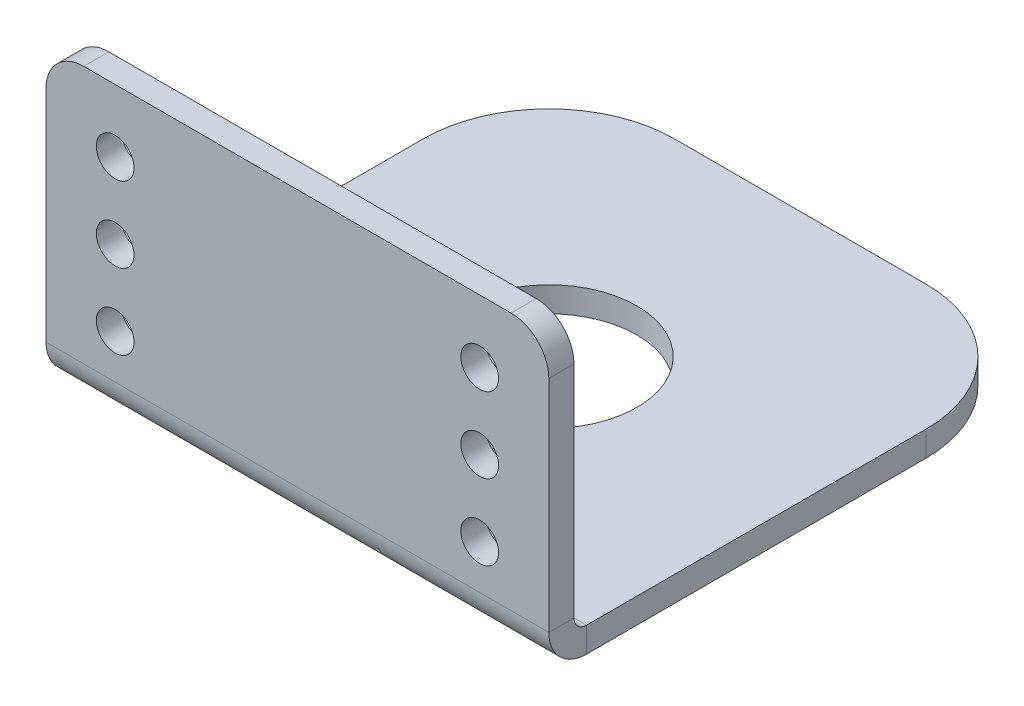
ISO-10303-21;
HEADER;
FILE_DESCRIPTION(('STEP AP214'),'2;1');
FILE_NAME('part.step','',(''),(''),'','','');
FILE_SCHEMA(('AUTOMOTIVE_DESIGN { 1 0 10303 214 1 1 1 1 }'));
ENDSEC;
DATA;
#1=APPLICATION_CONTEXT('core data for automotive mechanical design processes');
#2=APPLICATION_PROTOCOL_DEFINITION('international standard','automotive_design',2000,#1);
#3=PRODUCT_CONTEXT('',#1,'mechanical');
#4=PRODUCT('Part','Part','',(#3));
#5=PRODUCT_RELATED_PRODUCT_CATEGORY('part','',(#4));
#6=PRODUCT_DEFINITION_FORMATION('','',#4);
#7=PRODUCT_DEFINITION_CONTEXT('part definition',#1,'design');
#8=PRODUCT_DEFINITION('design','',#6,#7);
#9=PRODUCT_DEFINITION_SHAPE('','',#8);
#10=(LENGTH_UNIT() NAMED_UNIT(*) SI_UNIT(.MILLI.,.METRE.));
#11=(NAMED_UNIT(*) PLANE_ANGLE_UNIT() SI_UNIT($,.RADIAN.));
#12=(NAMED_UNIT(*) SI_UNIT($,.STERADIAN.) SOLID_ANGLE_UNIT());
#13=UNCERTAINTY_MEASURE_WITH_UNIT(LENGTH_MEASURE(1.E-05),#10,'distance_accuracy_value','');
#14=(GEOMETRIC_REPRESENTATION_CONTEXT(3) GLOBAL_UNCERTAINTY_ASSIGNED_CONTEXT((#13)) GLOBAL_UNIT_ASSIGNED_CONTEXT((#10,
#11,#12)) REPRESENTATION_CONTEXT('',''));
#15=CARTESIAN_POINT('',(0.,0.,0.));
#16=DIRECTION('',(0.,0.,1.));
#17=DIRECTION('',(1.,0.,0.));
#18=AXIS2_PLACEMENT_3D('',#15,#16,#17);
#19=CARTESIAN_POINT('',(20.,-2.,19.));
#20=DIRECTION('',(1.,0.,0.));
#21=DIRECTION('',(0.,0.,-1.));
#22=AXIS2_PLACEMENT_3D('',#19,#20,#21);
#23=PLANE('',#22);
#24=DIRECTION('',(0.,0.,-1.));
#25=VECTOR('',#24,1.);
#26=CARTESIAN_POINT('',(20.,-2.,19.));
#27=LINE('',#26,#25);
#28=CARTESIAN_POINT('',(20.,-2.,18.));
#29=VERTEX_POINT('',#28);
#30=CARTESIAN_POINT('',(20.,-2.,-9.));
#31=VERTEX_POINT('',#30);
#32=EDGE_CURVE('E204',#29,#31,#27,.T.);
#33=ORIENTED_EDGE('',*,*,#32,.T.);
#34=DIRECTION('',(0.,1.,0.));
#35=VECTOR('',#34,1.);
#36=CARTESIAN_POINT('',(20.,-2.,-9.));
#37=LINE('',#36,#35);
#38=CARTESIAN_POINT('',(20.,0.,-9.));
#39=VERTEX_POINT('',#38);
#40=EDGE_CURVE('E211',#31,#39,#37,.T.);
#41=ORIENTED_EDGE('',*,*,#40,.T.);
#42=DIRECTION('',(0.,0.,-1.));
#43=VECTOR('',#42,1.);
#44=CARTESIAN_POINT('',(20.,0.,19.));
#45=LINE('',#44,#43);
#46=CARTESIAN_POINT('',(20.,0.,18.));
#47=VERTEX_POINT('',#46);
#48=EDGE_CURVE('E213',#47,#39,#45,.T.);
#49=ORIENTED_EDGE('',*,*,#48,.F.);
#50=DIRECTION('',(0.,-1.,0.));
#51=VECTOR('',#50,1.);
#52=CARTESIAN_POINT('',(20.,0.,18.));
#53=LINE('',#52,#51);
#54=EDGE_CURVE('E178',#47,#29,#53,.T.);
#55=ORIENTED_EDGE('',*,*,#54,.T.);
#56=EDGE_LOOP('',(#33,#41,#49,#55));
#57=FACE_BOUND('',#56,.T.);
#58=ADVANCED_FACE('F41',(#57),#23,.T.);
#59=CARTESIAN_POINT('',(0.,-2.,0.));
#60=DIRECTION('',(0.,1.,0.));
#61=DIRECTION('',(0.,0.,1.));
#62=AXIS2_PLACEMENT_3D('',#59,#60,#61);
#63=PLANE('',#62);
#64=CARTESIAN_POINT('',(0.,-2.,1.));
#65=DIRECTION('',(0.,1.,0.));
#66=DIRECTION('',(0.,0.,1.));
#67=AXIS2_PLACEMENT_3D('',#64,#65,#66);
#68=CIRCLE('',#67,7.);
#69=CARTESIAN_POINT('',(0.,-2.,8.));
#70=VERTEX_POINT('',#69);
#71=EDGE_CURVE('E198',#70,#70,#68,.T.);
#72=ORIENTED_EDGE('',*,*,#71,.T.);
#73=EDGE_LOOP('',(#72));
#74=FACE_BOUND('',#73,.T.);
#75=CARTESIAN_POINT('',(0.,-2.,10.5));
#76=DIRECTION('',(0.,1.,0.));
#77=DIRECTION('',(0.,0.,1.));
#78=AXIS2_PLACEMENT_3D('',#75,#76,#77);
#79=CIRCLE('',#78,1.5);
#80=CARTESIAN_POINT('',(0.,-2.,12.));
#81=VERTEX_POINT('',#80);
#82=EDGE_CURVE('E190',#81,#81,#79,.T.);
#83=ORIENTED_EDGE('',*,*,#82,.T.);
#84=EDGE_LOOP('',(#83));
#85=FACE_BOUND('',#84,.T.);
#86=DIRECTION('',(-1.,0.,0.));
#87=VECTOR('',#86,1.);
#88=CARTESIAN_POINT('',(20.,-2.,-19.));
#89=LINE('',#88,#87);
#90=CARTESIAN_POINT('',(10.,-2.,-19.));
#91=VERTEX_POINT('',#90);
#92=CARTESIAN_POINT('',(-10.,-2.,-19.));
#93=VERTEX_POINT('',#92);
#94=EDGE_CURVE('E208',#91,#93,#89,.T.);
#95=ORIENTED_EDGE('',*,*,#94,.F.);
#96=CARTESIAN_POINT('',(10.,-2.,-9.));
#97=DIRECTION('',(0.,1.,0.));
#98=DIRECTION('',(0.,0.,1.));
#99=AXIS2_PLACEMENT_3D('',#96,#97,#98);
#100=CIRCLE('',#99,10.);
#101=EDGE_CURVE('E233',#91,#31,#100,.F.);
#102=ORIENTED_EDGE('',*,*,#101,.T.);
#103=ORIENTED_EDGE('',*,*,#32,.F.);
#104=DIRECTION('',(1.,0.,0.));
#105=VECTOR('',#104,1.);
#106=CARTESIAN_POINT('',(20.,-2.,18.));
#107=LINE('',#106,#105);
#108=CARTESIAN_POINT('',(-20.,-2.,18.));
#109=VERTEX_POINT('',#108);
#110=EDGE_CURVE('E142',#29,#109,#107,.F.);
#111=ORIENTED_EDGE('',*,*,#110,.T.);
#112=DIRECTION('',(0.,0.,1.));
#113=VECTOR('',#112,1.);
#114=CARTESIAN_POINT('',(-20.,-2.,19.));
#115=LINE('',#114,#113);
#116=CARTESIAN_POINT('',(-20.,-2.,-9.));
#117=VERTEX_POINT('',#116);
#118=EDGE_CURVE('E205',#117,#109,#115,.T.);
#119=ORIENTED_EDGE('',*,*,#118,.F.);
#120=CARTESIAN_POINT('',(-10.,-2.,-9.));
#121=DIRECTION('',(0.,1.,0.));
#122=DIRECTION('',(0.,0.,1.));
#123=AXIS2_PLACEMENT_3D('',#120,#121,#122);
#124=CIRCLE('',#123,10.);
#125=EDGE_CURVE('E229',#117,#93,#124,.F.);
#126=ORIENTED_EDGE('',*,*,#125,.T.);
#127=EDGE_LOOP('',(#95,#102,#103,#111,#119,#126));
#128=FACE_BOUND('',#127,.T.);
#129=ADVANCED_FACE('F345',(#74,#85,#128),#63,.F.);
#130=CARTESIAN_POINT('',(0.,0.,0.));
#131=DIRECTION('',(0.,1.,0.));
#132=DIRECTION('',(0.,0.,1.));
#133=AXIS2_PLACEMENT_3D('',#130,#131,#132);
#134=PLANE('',#133);
#135=CARTESIAN_POINT('',(0.,0.,1.));
#136=DIRECTION('',(0.,1.,0.));
#137=DIRECTION('',(0.,0.,1.));
#138=AXIS2_PLACEMENT_3D('',#135,#136,#137);
#139=CIRCLE('',#138,7.);
#140=CARTESIAN_POINT('',(0.,0.,8.));
#141=VERTEX_POINT('',#140);
#142=EDGE_CURVE('E194',#141,#141,#139,.T.);
#143=ORIENTED_EDGE('',*,*,#142,.F.);
#144=EDGE_LOOP('',(#143));
#145=FACE_BOUND('',#144,.T.);
#146=CARTESIAN_POINT('',(0.,0.,10.5));
#147=DIRECTION('',(0.,1.,0.));
#148=DIRECTION('',(0.,0.,1.));
#149=AXIS2_PLACEMENT_3D('',#146,#147,#148);
#150=CIRCLE('',#149,1.5);
#151=CARTESIAN_POINT('',(0.,0.,12.));
#152=VERTEX_POINT('',#151);
#153=EDGE_CURVE('E187',#152,#152,#150,.T.);
#154=ORIENTED_EDGE('',*,*,#153,.F.);
#155=EDGE_LOOP('',(#154));
#156=FACE_BOUND('',#155,.T.);
#157=ORIENTED_EDGE('',*,*,#48,.T.);
#158=CARTESIAN_POINT('',(10.,0.,-9.));
#159=DIRECTION('',(0.,1.,0.));
#160=DIRECTION('',(0.,0.,1.));
#161=AXIS2_PLACEMENT_3D('',#158,#159,#160);
#162=CIRCLE('',#161,10.);
#163=CARTESIAN_POINT('',(10.,0.,-19.));
#164=VERTEX_POINT('',#163);
#165=EDGE_CURVE('E225',#39,#164,#162,.T.);
#166=ORIENTED_EDGE('',*,*,#165,.T.);
#167=DIRECTION('',(-1.,0.,0.));
#168=VECTOR('',#167,1.);
#169=CARTESIAN_POINT('',(20.,0.,-19.));
#170=LINE('',#169,#168);
#171=CARTESIAN_POINT('',(-10.,0.,-19.));
#172=VERTEX_POINT('',#171);
#173=EDGE_CURVE('E202',#164,#172,#170,.T.);
#174=ORIENTED_EDGE('',*,*,#173,.T.);
#175=CARTESIAN_POINT('',(-10.,0.,-9.));
#176=DIRECTION('',(0.,1.,0.));
#177=DIRECTION('',(0.,0.,1.));
#178=AXIS2_PLACEMENT_3D('',#175,#176,#177);
#179=CIRCLE('',#178,10.);
#180=CARTESIAN_POINT('',(-20.,0.,-9.));
#181=VERTEX_POINT('',#180);
#182=EDGE_CURVE('E219',#172,#181,#179,.T.);
#183=ORIENTED_EDGE('',*,*,#182,.T.);
#184=DIRECTION('',(0.,0.,1.));
#185=VECTOR('',#184,1.);
#186=CARTESIAN_POINT('',(-20.,0.,19.));
#187=LINE('',#186,#185);
#188=CARTESIAN_POINT('',(-20.,0.,18.));
#189=VERTEX_POINT('',#188);
#190=EDGE_CURVE('E200',#181,#189,#187,.T.);
#191=ORIENTED_EDGE('',*,*,#190,.T.);
#192=DIRECTION('',(1.,0.,0.));
#193=VECTOR('',#192,1.);
#194=CARTESIAN_POINT('',(20.,0.,18.));
#195=LINE('',#194,#193);
#196=EDGE_CURVE('E177',#47,#189,#195,.F.);
#197=ORIENTED_EDGE('',*,*,#196,.F.);
#198=EDGE_LOOP('',(#157,#166,#174,#183,#191,#197));
#199=FACE_BOUND('',#198,.T.);
#200=ADVANCED_FACE('F349',(#145,#156,#199),#134,.T.);
#201=CARTESIAN_POINT('',(-20.,-2.,19.));
#202=DIRECTION('',(-1.,0.,0.));
#203=DIRECTION('',(0.,0.,1.));
#204=AXIS2_PLACEMENT_3D('',#201,#202,#203);
#205=PLANE('',#204);
#206=ORIENTED_EDGE('',*,*,#190,.F.);
#207=DIRECTION('',(0.,1.,0.));
#208=VECTOR('',#207,1.);
#209=CARTESIAN_POINT('',(-20.,-2.,-9.));
#210=LINE('',#209,#208);
#211=EDGE_CURVE('E231',#181,#117,#210,.F.);
#212=ORIENTED_EDGE('',*,*,#211,.T.);
#213=ORIENTED_EDGE('',*,*,#118,.T.);
#214=DIRECTION('',(0.,-1.,0.));
#215=VECTOR('',#214,1.);
#216=CARTESIAN_POINT('',(-20.,0.,18.));
#217=LINE('',#216,#215);
#218=EDGE_CURVE('E184',#189,#109,#217,.T.);
#219=ORIENTED_EDGE('',*,*,#218,.F.);
#220=EDGE_LOOP('',(#206,#212,#213,#219));
#221=FACE_BOUND('',#220,.T.);
#222=ADVANCED_FACE('F356',(#221),#205,.T.);
#223=CARTESIAN_POINT('',(20.,-2.,-19.));
#224=DIRECTION('',(0.,0.,-1.));
#225=DIRECTION('',(-1.,0.,0.));
#226=AXIS2_PLACEMENT_3D('',#223,#224,#225);
#227=PLANE('',#226);
#228=ORIENTED_EDGE('',*,*,#173,.F.);
#229=DIRECTION('',(0.,1.,0.));
#230=VECTOR('',#229,1.);
#231=CARTESIAN_POINT('',(10.,-2.,-19.));
#232=LINE('',#231,#230);
#233=EDGE_CURVE('E230',#164,#91,#232,.F.);
#234=ORIENTED_EDGE('',*,*,#233,.T.);
#235=ORIENTED_EDGE('',*,*,#94,.T.);
#236=DIRECTION('',(0.,1.,0.));
#237=VECTOR('',#236,1.);
#238=CARTESIAN_POINT('',(-10.,-2.,-19.));
#239=LINE('',#238,#237);
#240=EDGE_CURVE('E221',#93,#172,#239,.T.);
#241=ORIENTED_EDGE('',*,*,#240,.T.);
#242=EDGE_LOOP('',(#228,#234,#235,#241));
#243=FACE_BOUND('',#242,.T.);
#244=ADVANCED_FACE('F353',(#243),#227,.T.);
#245=CARTESIAN_POINT('',(0.,-2.,1.));
#246=DIRECTION('',(0.,1.,0.));
#247=DIRECTION('',(0.,0.,1.));
#248=AXIS2_PLACEMENT_3D('',#245,#246,#247);
#249=CYLINDRICAL_SURFACE('',#248,7.);
#250=ORIENTED_EDGE('',*,*,#71,.F.);
#251=EDGE_LOOP('',(#250));
#252=FACE_BOUND('',#251,.T.);
#253=ORIENTED_EDGE('',*,*,#142,.T.);
#254=EDGE_LOOP('',(#253));
#255=FACE_BOUND('',#254,.T.);
#256=ADVANCED_FACE('F480',(#252,#255),#249,.F.);
#257=CARTESIAN_POINT('',(0.,-2.,10.5));
#258=DIRECTION('',(0.,1.,0.));
#259=DIRECTION('',(0.,0.,1.));
#260=AXIS2_PLACEMENT_3D('',#257,#258,#259);
#261=CYLINDRICAL_SURFACE('',#260,1.5);
#262=ORIENTED_EDGE('',*,*,#82,.F.);
#263=EDGE_LOOP('',(#262));
#264=FACE_BOUND('',#263,.T.);
#265=ORIENTED_EDGE('',*,*,#153,.T.);
#266=EDGE_LOOP('',(#265));
#267=FACE_BOUND('',#266,.T.);
#268=ADVANCED_FACE('F449',(#264,#267),#261,.F.);
#269=CARTESIAN_POINT('',(-20.,0.999999999999997,18.));
#270=DIRECTION('',(-1.,0.,0.));
#271=DIRECTION('',(0.,0.,1.));
#272=AXIS2_PLACEMENT_3D('',#269,#270,#271);
#273=PLANE('',#272);
#274=DIRECTION('',(0.,0.,1.));
#275=VECTOR('',#274,1.);
#276=CARTESIAN_POINT('',(-20.,0.999999999999997,19.));
#277=LINE('',#276,#275);
#278=CARTESIAN_POINT('',(-20.,0.999999999999997,19.));
#279=VERTEX_POINT('',#278);
#280=CARTESIAN_POINT('',(-20.,0.999999999999997,21.));
#281=VERTEX_POINT('',#280);
#282=EDGE_CURVE('E262',#279,#281,#277,.T.);
#283=ORIENTED_EDGE('',*,*,#282,.F.);
#284=CARTESIAN_POINT('',(-20.,0.999999999999997,18.));
#285=DIRECTION('',(1.,0.,0.));
#286=DIRECTION('',(0.,0.,-1.));
#287=AXIS2_PLACEMENT_3D('',#284,#285,#286);
#288=CIRCLE('',#287,1.);
#289=EDGE_CURVE('E144',#189,#279,#288,.F.);
#290=ORIENTED_EDGE('',*,*,#289,.F.);
#291=ORIENTED_EDGE('',*,*,#218,.T.);
#292=CARTESIAN_POINT('',(-20.,0.999999999999997,18.));
#293=DIRECTION('',(1.,0.,0.));
#294=DIRECTION('',(0.,0.,-1.));
#295=AXIS2_PLACEMENT_3D('',#292,#293,#294);
#296=CIRCLE('',#295,3.);
#297=EDGE_CURVE('E172',#109,#281,#296,.F.);
#298=ORIENTED_EDGE('',*,*,#297,.T.);
#299=EDGE_LOOP('',(#283,#290,#291,#298));
#300=FACE_BOUND('',#299,.T.);
#301=ADVANCED_FACE('F445',(#300),#273,.T.);
#302=CARTESIAN_POINT('',(20.,0.999999999999997,18.));
#303=DIRECTION('',(-1.,0.,0.));
#304=DIRECTION('',(0.,0.,1.));
#305=AXIS2_PLACEMENT_3D('',#302,#303,#304);
#306=PLANE('',#305);
#307=CARTESIAN_POINT('',(20.,0.999999999999997,18.));
#308=DIRECTION('',(1.,0.,0.));
#309=DIRECTION('',(0.,0.,-1.));
#310=AXIS2_PLACEMENT_3D('',#307,#308,#309);
#311=CIRCLE('',#310,1.);
#312=CARTESIAN_POINT('',(20.,0.999999999999997,19.));
#313=VERTEX_POINT('',#312);
#314=EDGE_CURVE('E155',#313,#47,#311,.T.);
#315=ORIENTED_EDGE('',*,*,#314,.F.);
#316=DIRECTION('',(0.,0.,1.));
#317=VECTOR('',#316,1.);
#318=CARTESIAN_POINT('',(20.,0.999999999999997,19.));
#319=LINE('',#318,#317);
#320=CARTESIAN_POINT('',(20.,0.999999999999997,21.));
#321=VERTEX_POINT('',#320);
#322=EDGE_CURVE('E149',#313,#321,#319,.T.);
#323=ORIENTED_EDGE('',*,*,#322,.T.);
#324=CARTESIAN_POINT('',(20.,0.999999999999997,18.));
#325=DIRECTION('',(1.,0.,0.));
#326=DIRECTION('',(0.,0.,-1.));
#327=AXIS2_PLACEMENT_3D('',#324,#325,#326);
#328=CIRCLE('',#327,3.);
#329=EDGE_CURVE('E133',#321,#29,#328,.T.);
#330=ORIENTED_EDGE('',*,*,#329,.T.);
#331=ORIENTED_EDGE('',*,*,#54,.F.);
#332=EDGE_LOOP('',(#315,#323,#330,#331));
#333=FACE_BOUND('',#332,.T.);
#334=ADVANCED_FACE('F147',(#333),#306,.F.);
#335=CARTESIAN_POINT('',(20.,0.999999999999997,18.));
#336=DIRECTION('',(1.,0.,0.));
#337=DIRECTION('',(0.,0.,1.));
#338=AXIS2_PLACEMENT_3D('',#335,#336,#337);
#339=CYLINDRICAL_SURFACE('',#338,3.);
#340=ORIENTED_EDGE('',*,*,#110,.F.);
#341=ORIENTED_EDGE('',*,*,#329,.F.);
#342=DIRECTION('',(-1.,0.,0.));
#343=VECTOR('',#342,1.);
#344=CARTESIAN_POINT('',(0.,0.999999999999997,21.));
#345=LINE('',#344,#343);
#346=EDGE_CURVE('E138',#321,#281,#345,.T.);
#347=ORIENTED_EDGE('',*,*,#346,.T.);
#348=ORIENTED_EDGE('',*,*,#297,.F.);
#349=EDGE_LOOP('',(#340,#341,#347,#348));
#350=FACE_BOUND('',#349,.T.);
#351=ADVANCED_FACE('F136',(#350),#339,.T.);
#352=CARTESIAN_POINT('',(20.,0.999999999999997,18.));
#353=DIRECTION('',(1.,0.,0.));
#354=DIRECTION('',(0.,0.,1.));
#355=AXIS2_PLACEMENT_3D('',#352,#353,#354);
#356=CYLINDRICAL_SURFACE('',#355,1.);
#357=ORIENTED_EDGE('',*,*,#196,.T.);
#358=ORIENTED_EDGE('',*,*,#289,.T.);
#359=DIRECTION('',(1.,0.,0.));
#360=VECTOR('',#359,1.);
#361=CARTESIAN_POINT('',(-20.,0.999999999999997,19.));
#362=LINE('',#361,#360);
#363=EDGE_CURVE('E152',#279,#313,#362,.T.);
#364=ORIENTED_EDGE('',*,*,#363,.T.);
#365=ORIENTED_EDGE('',*,*,#314,.T.);
#366=EDGE_LOOP('',(#357,#358,#364,#365));
#367=FACE_BOUND('',#366,.T.);
#368=ADVANCED_FACE('F411',(#367),#356,.F.);
#369=CARTESIAN_POINT('',(-20.,0.,21.));
#370=DIRECTION('',(1.,0.,0.));
#371=DIRECTION('',(0.,1.,0.));
#372=AXIS2_PLACEMENT_3D('',#369,#370,#371);
#373=PLANE('',#372);
#374=DIRECTION('',(0.,-1.,0.));
#375=VECTOR('',#374,1.);
#376=CARTESIAN_POINT('',(-20.,0.,21.));
#377=LINE('',#376,#375);
#378=CARTESIAN_POINT('',(-20.,18.5,21.));
#379=VERTEX_POINT('',#378);
#380=EDGE_CURVE('E157',#379,#281,#377,.T.);
#381=ORIENTED_EDGE('',*,*,#380,.F.);
#382=DIRECTION('',(0.,0.,-1.));
#383=VECTOR('',#382,1.);
#384=CARTESIAN_POINT('',(-20.,18.5,21.));
#385=LINE('',#384,#383);
#386=CARTESIAN_POINT('',(-20.,18.5,19.));
#387=VERTEX_POINT('',#386);
#388=EDGE_CURVE('E11',#379,#387,#385,.T.);
#389=ORIENTED_EDGE('',*,*,#388,.T.);
#390=DIRECTION('',(0.,-1.,0.));
#391=VECTOR('',#390,1.);
#392=CARTESIAN_POINT('',(-20.,0.,19.));
#393=LINE('',#392,#391);
#394=EDGE_CURVE('E159',#387,#279,#393,.T.);
#395=ORIENTED_EDGE('',*,*,#394,.T.);
#396=ORIENTED_EDGE('',*,*,#282,.T.);
#397=EDGE_LOOP('',(#381,#389,#395,#396));
#398=FACE_BOUND('',#397,.T.);
#399=ADVANCED_FACE('F257',(#398),#373,.F.);
#400=CARTESIAN_POINT('',(20.,21.5,21.));
#401=DIRECTION('',(-1.,0.,0.));
#402=DIRECTION('',(0.,-1.,0.));
#403=AXIS2_PLACEMENT_3D('',#400,#401,#402);
#404=PLANE('',#403);
#405=DIRECTION('',(0.,1.,0.));
#406=VECTOR('',#405,1.);
#407=CARTESIAN_POINT('',(20.,21.5,19.));
#408=LINE('',#407,#406);
#409=CARTESIAN_POINT('',(20.,18.5,19.));
#410=VERTEX_POINT('',#409);
#411=EDGE_CURVE('E168',#313,#410,#408,.T.);
#412=ORIENTED_EDGE('',*,*,#411,.T.);
#413=DIRECTION('',(0.,0.,-1.));
#414=VECTOR('',#413,1.);
#415=CARTESIAN_POINT('',(20.,18.5,21.));
#416=LINE('',#415,#414);
#417=CARTESIAN_POINT('',(20.,18.5,21.));
#418=VERTEX_POINT('',#417);
#419=EDGE_CURVE('E64',#410,#418,#416,.F.);
#420=ORIENTED_EDGE('',*,*,#419,.T.);
#421=DIRECTION('',(0.,1.,0.));
#422=VECTOR('',#421,1.);
#423=CARTESIAN_POINT('',(20.,21.5,21.));
#424=LINE('',#423,#422);
#425=EDGE_CURVE('E160',#321,#418,#424,.T.);
#426=ORIENTED_EDGE('',*,*,#425,.F.);
#427=ORIENTED_EDGE('',*,*,#322,.F.);
#428=EDGE_LOOP('',(#412,#420,#426,#427));
#429=FACE_BOUND('',#428,.T.);
#430=ADVANCED_FACE('F165',(#429),#404,.F.);
#431=CARTESIAN_POINT('',(0.,0.,21.));
#432=DIRECTION('',(0.,0.,-1.));
#433=DIRECTION('',(-1.,0.,0.));
#434=AXIS2_PLACEMENT_3D('',#431,#432,#433);
#435=PLANE('',#434);
#436=CARTESIAN_POINT('',(-14.5,16.5,21.));
#437=DIRECTION('',(0.,0.,-1.));
#438=DIRECTION('',(1.,0.,0.));
#439=AXIS2_PLACEMENT_3D('',#436,#437,#438);
#440=CIRCLE('',#439,1.5);
#441=CARTESIAN_POINT('',(-13.,16.5,21.));
#442=VERTEX_POINT('',#441);
#443=EDGE_CURVE('E296',#442,#442,#440,.T.);
#444=ORIENTED_EDGE('',*,*,#443,.T.);
#445=EDGE_LOOP('',(#444));
#446=FACE_BOUND('',#445,.T.);
#447=CARTESIAN_POINT('',(-14.4999999999999,10.5,21.));
#448=DIRECTION('',(0.,0.,-1.));
#449=DIRECTION('',(1.,0.,0.));
#450=AXIS2_PLACEMENT_3D('',#447,#448,#449);
#451=CIRCLE('',#450,1.5);
#452=CARTESIAN_POINT('',(-12.9999999999999,10.5,21.));
#453=VERTEX_POINT('',#452);
#454=EDGE_CURVE('E287',#453,#453,#451,.T.);
#455=ORIENTED_EDGE('',*,*,#454,.T.);
#456=EDGE_LOOP('',(#455));
#457=FACE_BOUND('',#456,.T.);
#458=CARTESIAN_POINT('',(-14.4999999999999,4.5,21.));
#459=DIRECTION('',(0.,0.,-1.));
#460=DIRECTION('',(1.,0.,0.));
#461=AXIS2_PLACEMENT_3D('',#458,#459,#460);
#462=CIRCLE('',#461,1.5);
#463=CARTESIAN_POINT('',(-12.9999999999999,4.5,21.));
#464=VERTEX_POINT('',#463);
#465=EDGE_CURVE('E284',#464,#464,#462,.T.);
#466=ORIENTED_EDGE('',*,*,#465,.T.);
#467=EDGE_LOOP('',(#466));
#468=FACE_BOUND('',#467,.T.);
#469=CARTESIAN_POINT('',(14.4999999999999,4.5,21.));
#470=DIRECTION('',(0.,0.,-1.));
#471=DIRECTION('',(-1.,0.,0.));
#472=AXIS2_PLACEMENT_3D('',#469,#470,#471);
#473=CIRCLE('',#472,1.5);
#474=CARTESIAN_POINT('',(12.9999999999999,4.5,21.));
#475=VERTEX_POINT('',#474);
#476=EDGE_CURVE('E279',#475,#475,#473,.T.);
#477=ORIENTED_EDGE('',*,*,#476,.T.);
#478=EDGE_LOOP('',(#477));
#479=FACE_BOUND('',#478,.T.);
#480=CARTESIAN_POINT('',(14.4999999999999,10.5,21.));
#481=DIRECTION('',(0.,0.,-1.));
#482=DIRECTION('',(-1.,0.,0.));
#483=AXIS2_PLACEMENT_3D('',#480,#481,#482);
#484=CIRCLE('',#483,1.5);
#485=CARTESIAN_POINT('',(12.9999999999999,10.5,21.));
#486=VERTEX_POINT('',#485);
#487=EDGE_CURVE('E275',#486,#486,#484,.T.);
#488=ORIENTED_EDGE('',*,*,#487,.T.);
#489=EDGE_LOOP('',(#488));
#490=FACE_BOUND('',#489,.T.);
#491=CARTESIAN_POINT('',(14.5,16.5,21.));
#492=DIRECTION('',(0.,0.,-1.));
#493=DIRECTION('',(-1.,0.,0.));
#494=AXIS2_PLACEMENT_3D('',#491,#492,#493);
#495=CIRCLE('',#494,1.5);
#496=CARTESIAN_POINT('',(13.,16.5,21.));
#497=VERTEX_POINT('',#496);
#498=EDGE_CURVE('E266',#497,#497,#495,.T.);
#499=ORIENTED_EDGE('',*,*,#498,.T.);
#500=EDGE_LOOP('',(#499));
#501=FACE_BOUND('',#500,.T.);
#502=ORIENTED_EDGE('',*,*,#425,.T.);
#503=CARTESIAN_POINT('',(17.,18.5,21.));
#504=DIRECTION('',(0.,0.,-1.));
#505=DIRECTION('',(-1.,0.,0.));
#506=AXIS2_PLACEMENT_3D('',#503,#504,#505);
#507=CIRCLE('',#506,3.);
#508=CARTESIAN_POINT('',(17.,21.5,21.));
#509=VERTEX_POINT('',#508);
#510=EDGE_CURVE('E47',#418,#509,#507,.F.);
#511=ORIENTED_EDGE('',*,*,#510,.T.);
#512=DIRECTION('',(-1.,0.,0.));
#513=VECTOR('',#512,1.);
#514=CARTESIAN_POINT('',(-20.,21.5,21.));
#515=LINE('',#514,#513);
#516=CARTESIAN_POINT('',(-17.,21.5,21.));
#517=VERTEX_POINT('',#516);
#518=EDGE_CURVE('E162',#509,#517,#515,.T.);
#519=ORIENTED_EDGE('',*,*,#518,.T.);
#520=CARTESIAN_POINT('',(-17.,18.5,21.));
#521=DIRECTION('',(0.,0.,-1.));
#522=DIRECTION('',(-1.,0.,0.));
#523=AXIS2_PLACEMENT_3D('',#520,#521,#522);
#524=CIRCLE('',#523,3.);
#525=EDGE_CURVE('E57',#517,#379,#524,.F.);
#526=ORIENTED_EDGE('',*,*,#525,.T.);
#527=ORIENTED_EDGE('',*,*,#380,.T.);
#528=ORIENTED_EDGE('',*,*,#346,.F.);
#529=EDGE_LOOP('',(#502,#511,#519,#526,#527,#528));
#530=FACE_BOUND('',#529,.T.);
#531=ADVANCED_FACE('F156',(#446,#457,#468,#479,#490,#501,#530),#435,.F.);
#532=CARTESIAN_POINT('',(0.,0.,19.));
#533=DIRECTION('',(0.,0.,-1.));
#534=DIRECTION('',(-1.,0.,0.));
#535=AXIS2_PLACEMENT_3D('',#532,#533,#534);
#536=PLANE('',#535);
#537=CARTESIAN_POINT('',(-14.5,16.5,19.));
#538=DIRECTION('',(0.,0.,-1.));
#539=DIRECTION('',(1.,0.,0.));
#540=AXIS2_PLACEMENT_3D('',#537,#538,#539);
#541=CIRCLE('',#540,1.5);
#542=CARTESIAN_POINT('',(-13.,16.5,19.));
#543=VERTEX_POINT('',#542);
#544=EDGE_CURVE('E298',#543,#543,#541,.T.);
#545=ORIENTED_EDGE('',*,*,#544,.F.);
#546=EDGE_LOOP('',(#545));
#547=FACE_BOUND('',#546,.T.);
#548=CARTESIAN_POINT('',(-14.4999999999999,10.5,19.));
#549=DIRECTION('',(0.,0.,-1.));
#550=DIRECTION('',(1.,0.,0.));
#551=AXIS2_PLACEMENT_3D('',#548,#549,#550);
#552=CIRCLE('',#551,1.5);
#553=CARTESIAN_POINT('',(-12.9999999999999,10.5,19.));
#554=VERTEX_POINT('',#553);
#555=EDGE_CURVE('E291',#554,#554,#552,.T.);
#556=ORIENTED_EDGE('',*,*,#555,.F.);
#557=EDGE_LOOP('',(#556));
#558=FACE_BOUND('',#557,.T.);
#559=CARTESIAN_POINT('',(-14.4999999999999,4.5,19.));
#560=DIRECTION('',(0.,0.,-1.));
#561=DIRECTION('',(1.,0.,0.));
#562=AXIS2_PLACEMENT_3D('',#559,#560,#561);
#563=CIRCLE('',#562,1.5);
#564=CARTESIAN_POINT('',(-12.9999999999999,4.5,19.));
#565=VERTEX_POINT('',#564);
#566=EDGE_CURVE('E290',#565,#565,#563,.T.);
#567=ORIENTED_EDGE('',*,*,#566,.F.);
#568=EDGE_LOOP('',(#567));
#569=FACE_BOUND('',#568,.T.);
#570=CARTESIAN_POINT('',(14.4999999999999,4.5,19.));
#571=DIRECTION('',(0.,0.,-1.));
#572=DIRECTION('',(-1.,0.,0.));
#573=AXIS2_PLACEMENT_3D('',#570,#571,#572);
#574=CIRCLE('',#573,1.5);
#575=CARTESIAN_POINT('',(12.9999999999999,4.5,19.));
#576=VERTEX_POINT('',#575);
#577=EDGE_CURVE('E283',#576,#576,#574,.T.);
#578=ORIENTED_EDGE('',*,*,#577,.F.);
#579=EDGE_LOOP('',(#578));
#580=FACE_BOUND('',#579,.T.);
#581=CARTESIAN_POINT('',(14.4999999999999,10.5,19.));
#582=DIRECTION('',(0.,0.,-1.));
#583=DIRECTION('',(-1.,0.,0.));
#584=AXIS2_PLACEMENT_3D('',#581,#582,#583);
#585=CIRCLE('',#584,1.5);
#586=CARTESIAN_POINT('',(12.9999999999999,10.5,19.));
#587=VERTEX_POINT('',#586);
#588=EDGE_CURVE('E274',#587,#587,#585,.T.);
#589=ORIENTED_EDGE('',*,*,#588,.F.);
#590=EDGE_LOOP('',(#589));
#591=FACE_BOUND('',#590,.T.);
#592=CARTESIAN_POINT('',(14.5,16.5,19.));
#593=DIRECTION('',(0.,0.,-1.));
#594=DIRECTION('',(-1.,0.,0.));
#595=AXIS2_PLACEMENT_3D('',#592,#593,#594);
#596=CIRCLE('',#595,1.5);
#597=CARTESIAN_POINT('',(13.,16.5,19.));
#598=VERTEX_POINT('',#597);
#599=EDGE_CURVE('E267',#598,#598,#596,.T.);
#600=ORIENTED_EDGE('',*,*,#599,.F.);
#601=EDGE_LOOP('',(#600));
#602=FACE_BOUND('',#601,.T.);
#603=DIRECTION('',(-1.,0.,0.));
#604=VECTOR('',#603,1.);
#605=CARTESIAN_POINT('',(-20.,21.5,19.));
#606=LINE('',#605,#604);
#607=CARTESIAN_POINT('',(17.,21.5,19.));
#608=VERTEX_POINT('',#607);
#609=CARTESIAN_POINT('',(-17.,21.5,19.));
#610=VERTEX_POINT('',#609);
#611=EDGE_CURVE('E167',#608,#610,#606,.T.);
#612=ORIENTED_EDGE('',*,*,#611,.F.);
#613=CARTESIAN_POINT('',(17.,18.5,19.));
#614=DIRECTION('',(0.,0.,-1.));
#615=DIRECTION('',(-1.,0.,0.));
#616=AXIS2_PLACEMENT_3D('',#613,#614,#615);
#617=CIRCLE('',#616,3.);
#618=EDGE_CURVE('E242',#608,#410,#617,.T.);
#619=ORIENTED_EDGE('',*,*,#618,.T.);
#620=ORIENTED_EDGE('',*,*,#411,.F.);
#621=ORIENTED_EDGE('',*,*,#363,.F.);
#622=ORIENTED_EDGE('',*,*,#394,.F.);
#623=CARTESIAN_POINT('',(-17.,18.5,19.));
#624=DIRECTION('',(0.,0.,-1.));
#625=DIRECTION('',(-1.,0.,0.));
#626=AXIS2_PLACEMENT_3D('',#623,#624,#625);
#627=CIRCLE('',#626,3.);
#628=EDGE_CURVE('E238',#387,#610,#627,.T.);
#629=ORIENTED_EDGE('',*,*,#628,.T.);
#630=EDGE_LOOP('',(#612,#619,#620,#621,#622,#629));
#631=FACE_BOUND('',#630,.T.);
#632=ADVANCED_FACE('F255',(#547,#558,#569,#580,#591,#602,#631),#536,.T.);
#633=CARTESIAN_POINT('',(-20.,21.5,21.));
#634=DIRECTION('',(0.,-1.,0.));
#635=DIRECTION('',(0.,0.,-1.));
#636=AXIS2_PLACEMENT_3D('',#633,#634,#635);
#637=PLANE('',#636);
#638=ORIENTED_EDGE('',*,*,#518,.F.);
#639=DIRECTION('',(0.,0.,-1.));
#640=VECTOR('',#639,1.);
#641=CARTESIAN_POINT('',(17.,21.5,21.));
#642=LINE('',#641,#640);
#643=EDGE_CURVE('E240',#509,#608,#642,.T.);
#644=ORIENTED_EDGE('',*,*,#643,.T.);
#645=ORIENTED_EDGE('',*,*,#611,.T.);
#646=DIRECTION('',(0.,0.,-1.));
#647=VECTOR('',#646,1.);
#648=CARTESIAN_POINT('',(-17.,21.5,21.));
#649=LINE('',#648,#647);
#650=EDGE_CURVE('E232',#610,#517,#649,.F.);
#651=ORIENTED_EDGE('',*,*,#650,.T.);
#652=EDGE_LOOP('',(#638,#644,#645,#651));
#653=FACE_BOUND('',#652,.T.);
#654=ADVANCED_FACE('F248',(#653),#637,.F.);
#655=CARTESIAN_POINT('',(10.,-2.,-9.));
#656=DIRECTION('',(0.,1.,0.));
#657=DIRECTION('',(0.,0.,1.));
#658=AXIS2_PLACEMENT_3D('',#655,#656,#657);
#659=CYLINDRICAL_SURFACE('',#658,10.);
#660=ORIENTED_EDGE('',*,*,#101,.F.);
#661=ORIENTED_EDGE('',*,*,#233,.F.);
#662=ORIENTED_EDGE('',*,*,#165,.F.);
#663=ORIENTED_EDGE('',*,*,#40,.F.);
#664=EDGE_LOOP('',(#660,#661,#662,#663));
#665=FACE_BOUND('',#664,.T.);
#666=ADVANCED_FACE('F360',(#665),#659,.T.);
#667=CARTESIAN_POINT('',(-10.,-2.,-9.));
#668=DIRECTION('',(0.,1.,0.));
#669=DIRECTION('',(0.,0.,1.));
#670=AXIS2_PLACEMENT_3D('',#667,#668,#669);
#671=CYLINDRICAL_SURFACE('',#670,10.);
#672=ORIENTED_EDGE('',*,*,#125,.F.);
#673=ORIENTED_EDGE('',*,*,#211,.F.);
#674=ORIENTED_EDGE('',*,*,#182,.F.);
#675=ORIENTED_EDGE('',*,*,#240,.F.);
#676=EDGE_LOOP('',(#672,#673,#674,#675));
#677=FACE_BOUND('',#676,.T.);
#678=ADVANCED_FACE('F361',(#677),#671,.T.);
#679=CARTESIAN_POINT('',(17.,18.5,21.));
#680=DIRECTION('',(0.,0.,-1.));
#681=DIRECTION('',(-1.,0.,0.));
#682=AXIS2_PLACEMENT_3D('',#679,#680,#681);
#683=CYLINDRICAL_SURFACE('',#682,3.);
#684=ORIENTED_EDGE('',*,*,#510,.F.);
#685=ORIENTED_EDGE('',*,*,#419,.F.);
#686=ORIENTED_EDGE('',*,*,#618,.F.);
#687=ORIENTED_EDGE('',*,*,#643,.F.);
#688=EDGE_LOOP('',(#684,#685,#686,#687));
#689=FACE_BOUND('',#688,.T.);
#690=ADVANCED_FACE('F252',(#689),#683,.T.);
#691=CARTESIAN_POINT('',(-17.,18.5,21.));
#692=DIRECTION('',(0.,0.,-1.));
#693=DIRECTION('',(-1.,0.,0.));
#694=AXIS2_PLACEMENT_3D('',#691,#692,#693);
#695=CYLINDRICAL_SURFACE('',#694,3.);
#696=ORIENTED_EDGE('',*,*,#525,.F.);
#697=ORIENTED_EDGE('',*,*,#650,.F.);
#698=ORIENTED_EDGE('',*,*,#628,.F.);
#699=ORIENTED_EDGE('',*,*,#388,.F.);
#700=EDGE_LOOP('',(#696,#697,#698,#699));
#701=FACE_BOUND('',#700,.T.);
#702=ADVANCED_FACE('F43',(#701),#695,.T.);
#703=CARTESIAN_POINT('',(14.5,16.5,21.));
#704=DIRECTION('',(0.,0.,-1.));
#705=DIRECTION('',(-1.,0.,0.));
#706=AXIS2_PLACEMENT_3D('',#703,#704,#705);
#707=CYLINDRICAL_SURFACE('',#706,1.5);
#708=ORIENTED_EDGE('',*,*,#498,.F.);
#709=EDGE_LOOP('',(#708));
#710=FACE_BOUND('',#709,.T.);
#711=ORIENTED_EDGE('',*,*,#599,.T.);
#712=EDGE_LOOP('',(#711));
#713=FACE_BOUND('',#712,.T.);
#714=ADVANCED_FACE('F330',(#710,#713),#707,.F.);
#715=CARTESIAN_POINT('',(14.4999999999999,10.5,21.));
#716=DIRECTION('',(0.,0.,-1.));
#717=DIRECTION('',(-1.,0.,0.));
#718=AXIS2_PLACEMENT_3D('',#715,#716,#717);
#719=CYLINDRICAL_SURFACE('',#718,1.5);
#720=ORIENTED_EDGE('',*,*,#487,.F.);
#721=EDGE_LOOP('',(#720));
#722=FACE_BOUND('',#721,.T.);
#723=ORIENTED_EDGE('',*,*,#588,.T.);
#724=EDGE_LOOP('',(#723));
#725=FACE_BOUND('',#724,.T.);
#726=ADVANCED_FACE('F328',(#722,#725),#719,.F.);
#727=CARTESIAN_POINT('',(14.4999999999999,4.5,21.));
#728=DIRECTION('',(0.,0.,-1.));
#729=DIRECTION('',(-1.,0.,0.));
#730=AXIS2_PLACEMENT_3D('',#727,#728,#729);
#731=CYLINDRICAL_SURFACE('',#730,1.5);
#732=ORIENTED_EDGE('',*,*,#476,.F.);
#733=EDGE_LOOP('',(#732));
#734=FACE_BOUND('',#733,.T.);
#735=ORIENTED_EDGE('',*,*,#577,.T.);
#736=EDGE_LOOP('',(#735));
#737=FACE_BOUND('',#736,.T.);
#738=ADVANCED_FACE('F333',(#734,#737),#731,.F.);
#739=CARTESIAN_POINT('',(-14.4999999999999,4.5,21.));
#740=DIRECTION('',(0.,0.,-1.));
#741=DIRECTION('',(-1.,0.,0.));
#742=AXIS2_PLACEMENT_3D('',#739,#740,#741);
#743=CYLINDRICAL_SURFACE('',#742,1.5);
#744=ORIENTED_EDGE('',*,*,#465,.F.);
#745=EDGE_LOOP('',(#744));
#746=FACE_BOUND('',#745,.T.);
#747=ORIENTED_EDGE('',*,*,#566,.T.);
#748=EDGE_LOOP('',(#747));
#749=FACE_BOUND('',#748,.T.);
#750=ADVANCED_FACE('F542',(#746,#749),#743,.F.);
#751=CARTESIAN_POINT('',(-14.4999999999999,10.5,21.));
#752=DIRECTION('',(0.,0.,-1.));
#753=DIRECTION('',(-1.,0.,0.));
#754=AXIS2_PLACEMENT_3D('',#751,#752,#753);
#755=CYLINDRICAL_SURFACE('',#754,1.5);
#756=ORIENTED_EDGE('',*,*,#454,.F.);
#757=EDGE_LOOP('',(#756));
#758=FACE_BOUND('',#757,.T.);
#759=ORIENTED_EDGE('',*,*,#555,.T.);
#760=EDGE_LOOP('',(#759));
#761=FACE_BOUND('',#760,.T.);
#762=ADVANCED_FACE('F309',(#758,#761),#755,.F.);
#763=CARTESIAN_POINT('',(-14.5,16.5,21.));
#764=DIRECTION('',(0.,0.,-1.));
#765=DIRECTION('',(-1.,0.,0.));
#766=AXIS2_PLACEMENT_3D('',#763,#764,#765);
#767=CYLINDRICAL_SURFACE('',#766,1.5);
#768=ORIENTED_EDGE('',*,*,#443,.F.);
#769=EDGE_LOOP('',(#768));
#770=FACE_BOUND('',#769,.T.);
#771=ORIENTED_EDGE('',*,*,#544,.T.);
#772=EDGE_LOOP('',(#771));
#773=FACE_BOUND('',#772,.T.);
#774=ADVANCED_FACE('F307',(#770,#773),#767,.F.);
#775=CLOSED_SHELL('',(#58,#129,#200,#222,#244,#256,#268,#301,#334,#351,#368,#399,#430,#531,#632,
#654,#666,#678,#690,#702,#714,#726,#738,#750,#762,#774));
#776=MANIFOLD_SOLID_BREP('B2',#775);
#777=ADVANCED_BREP_SHAPE_REPRESENTATION('',(#18,#776),#14);
#778=SHAPE_DEFINITION_REPRESENTATION(#9,#777);
ENDSEC;
END-ISO-10303-21;
